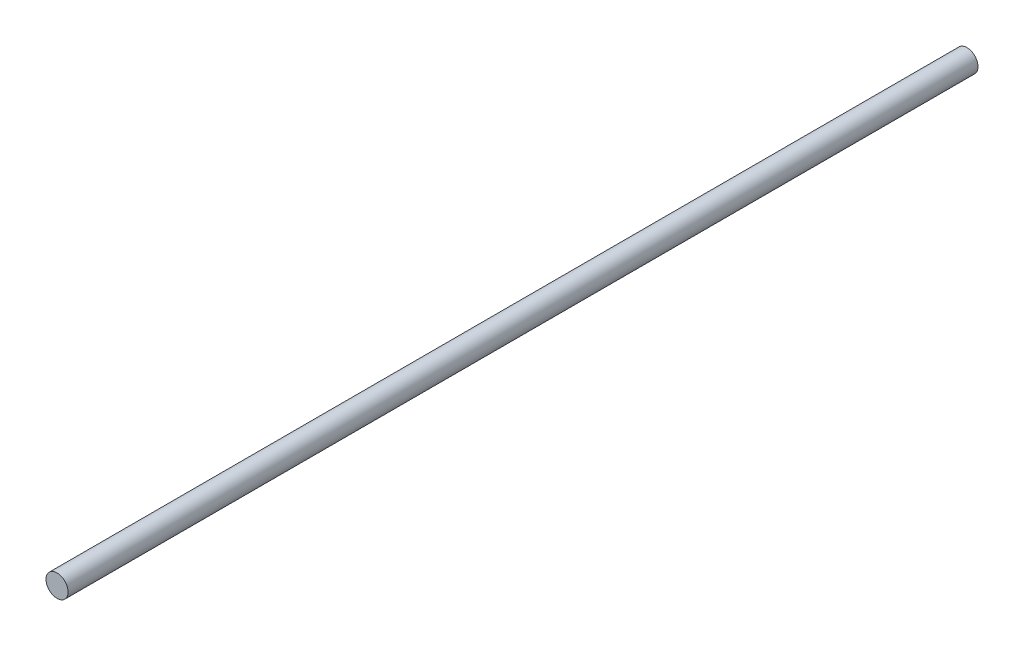
ISO-10303-21;
HEADER;
FILE_DESCRIPTION(('STEP AP214'),'2;1');
FILE_NAME('part.step','',(''),(''),'','','');
FILE_SCHEMA(('AUTOMOTIVE_DESIGN { 1 0 10303 214 1 1 1 1 }'));
ENDSEC;
DATA;
#1=APPLICATION_CONTEXT('core data for automotive mechanical design processes');
#2=APPLICATION_PROTOCOL_DEFINITION('international standard','automotive_design',2000,#1);
#3=PRODUCT_CONTEXT('',#1,'mechanical');
#4=PRODUCT('Part','Part','',(#3));
#5=PRODUCT_RELATED_PRODUCT_CATEGORY('part','',(#4));
#6=PRODUCT_DEFINITION_FORMATION('','',#4);
#7=PRODUCT_DEFINITION_CONTEXT('part definition',#1,'design');
#8=PRODUCT_DEFINITION('design','',#6,#7);
#9=PRODUCT_DEFINITION_SHAPE('','',#8);
#10=(LENGTH_UNIT() NAMED_UNIT(*) SI_UNIT(.MILLI.,.METRE.));
#11=(NAMED_UNIT(*) PLANE_ANGLE_UNIT() SI_UNIT($,.RADIAN.));
#12=(NAMED_UNIT(*) SI_UNIT($,.STERADIAN.) SOLID_ANGLE_UNIT());
#13=UNCERTAINTY_MEASURE_WITH_UNIT(LENGTH_MEASURE(1.E-05),#10,'distance_accuracy_value','');
#14=(GEOMETRIC_REPRESENTATION_CONTEXT(3) GLOBAL_UNCERTAINTY_ASSIGNED_CONTEXT((#13)) GLOBAL_UNIT_ASSIGNED_CONTEXT((#10,
#11,#12)) REPRESENTATION_CONTEXT('',''));
#15=CARTESIAN_POINT('',(0.,0.,0.));
#16=DIRECTION('',(0.,0.,1.));
#17=DIRECTION('',(1.,0.,0.));
#18=AXIS2_PLACEMENT_3D('',#15,#16,#17);
#19=CARTESIAN_POINT('',(0.,0.,0.));
#20=DIRECTION('',(0.,0.,1.));
#21=DIRECTION('',(1.,0.,0.));
#22=AXIS2_PLACEMENT_3D('',#19,#20,#21);
#23=CYLINDRICAL_SURFACE('',#22,3.75);
#24=CARTESIAN_POINT('',(0.,0.,0.));
#25=DIRECTION('',(0.,0.,1.));
#26=DIRECTION('',(1.,0.,0.));
#27=AXIS2_PLACEMENT_3D('',#24,#25,#26);
#28=CIRCLE('',#27,3.75);
#29=CARTESIAN_POINT('',(3.75,0.,0.));
#30=VERTEX_POINT('',#29);
#31=EDGE_CURVE('E10',#30,#30,#28,.T.);
#32=ORIENTED_EDGE('',*,*,#31,.T.);
#33=EDGE_LOOP('',(#32));
#34=FACE_BOUND('',#33,.T.);
#35=CARTESIAN_POINT('',(0.,0.,309.));
#36=DIRECTION('',(0.,0.,1.));
#37=DIRECTION('',(1.,0.,0.));
#38=AXIS2_PLACEMENT_3D('',#35,#36,#37);
#39=CIRCLE('',#38,3.75);
#40=CARTESIAN_POINT('',(3.75,0.,309.));
#41=VERTEX_POINT('',#40);
#42=EDGE_CURVE('E39',#41,#41,#39,.T.);
#43=ORIENTED_EDGE('',*,*,#42,.F.);
#44=EDGE_LOOP('',(#43));
#45=FACE_BOUND('',#44,.T.);
#46=ADVANCED_FACE('F33',(#34,#45),#23,.T.);
#47=CARTESIAN_POINT('',(3.75,0.,0.));
#48=DIRECTION('',(0.,0.,-1.));
#49=DIRECTION('',(-1.,0.,0.));
#50=AXIS2_PLACEMENT_3D('',#47,#48,#49);
#51=PLANE('',#50);
#52=ORIENTED_EDGE('',*,*,#31,.F.);
#53=EDGE_LOOP('',(#52));
#54=FACE_BOUND('',#53,.T.);
#55=ADVANCED_FACE('F48',(#54),#51,.T.);
#56=CARTESIAN_POINT('',(0.,0.,309.));
#57=DIRECTION('',(0.,0.,1.));
#58=DIRECTION('',(1.,0.,0.));
#59=AXIS2_PLACEMENT_3D('',#56,#57,#58);
#60=PLANE('',#59);
#61=ORIENTED_EDGE('',*,*,#42,.T.);
#62=EDGE_LOOP('',(#61));
#63=FACE_BOUND('',#62,.T.);
#64=ADVANCED_FACE('F45',(#63),#60,.T.);
#65=CLOSED_SHELL('',(#46,#55,#64));
#66=MANIFOLD_SOLID_BREP('B2',#65);
#67=ADVANCED_BREP_SHAPE_REPRESENTATION('',(#18,#66),#14);
#68=SHAPE_DEFINITION_REPRESENTATION(#9,#67);
ENDSEC;
END-ISO-10303-21;
